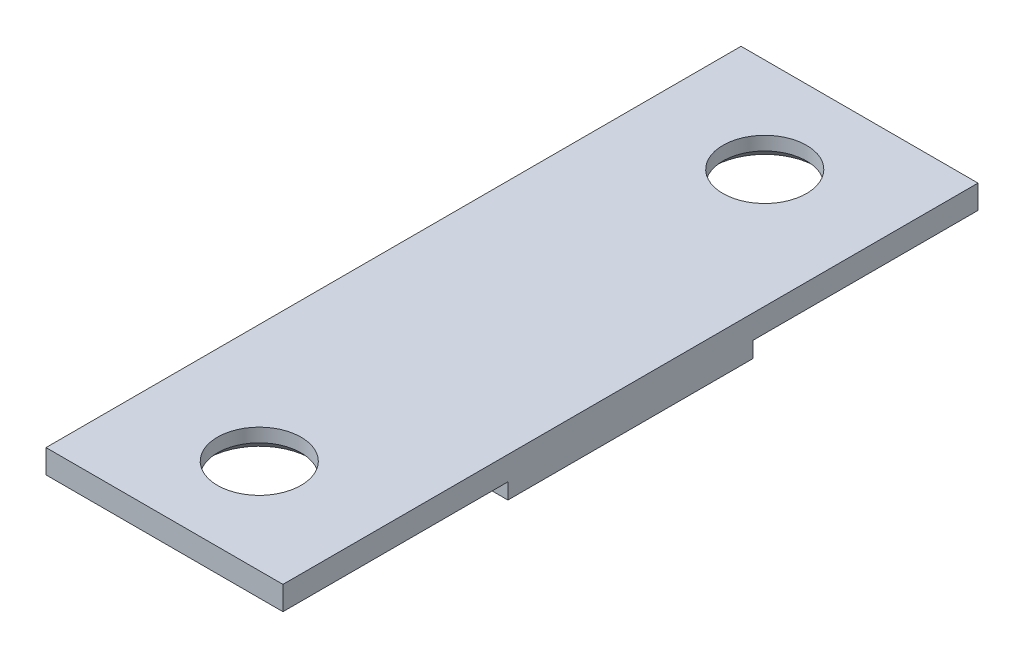
ISO-10303-21;
HEADER;
FILE_DESCRIPTION(('STEP AP214'),'2;1');
FILE_NAME('part.step','',(''),(''),'','','');
FILE_SCHEMA(('AUTOMOTIVE_DESIGN { 1 0 10303 214 1 1 1 1 }'));
ENDSEC;
DATA;
#1=APPLICATION_CONTEXT('core data for automotive mechanical design processes');
#2=APPLICATION_PROTOCOL_DEFINITION('international standard','automotive_design',2000,#1);
#3=PRODUCT_CONTEXT('',#1,'mechanical');
#4=PRODUCT('Part','Part','',(#3));
#5=PRODUCT_RELATED_PRODUCT_CATEGORY('part','',(#4));
#6=PRODUCT_DEFINITION_FORMATION('','',#4);
#7=PRODUCT_DEFINITION_CONTEXT('part definition',#1,'design');
#8=PRODUCT_DEFINITION('design','',#6,#7);
#9=PRODUCT_DEFINITION_SHAPE('','',#8);
#10=(LENGTH_UNIT() NAMED_UNIT(*) SI_UNIT(.MILLI.,.METRE.));
#11=(NAMED_UNIT(*) PLANE_ANGLE_UNIT() SI_UNIT($,.RADIAN.));
#12=(NAMED_UNIT(*) SI_UNIT($,.STERADIAN.) SOLID_ANGLE_UNIT());
#13=UNCERTAINTY_MEASURE_WITH_UNIT(LENGTH_MEASURE(1.E-05),#10,'distance_accuracy_value','');
#14=(GEOMETRIC_REPRESENTATION_CONTEXT(3) GLOBAL_UNCERTAINTY_ASSIGNED_CONTEXT((#13)) GLOBAL_UNIT_ASSIGNED_CONTEXT((#10,
#11,#12)) REPRESENTATION_CONTEXT('',''));
#15=CARTESIAN_POINT('',(0.,0.,0.));
#16=DIRECTION('',(0.,0.,1.));
#17=DIRECTION('',(1.,0.,0.));
#18=AXIS2_PLACEMENT_3D('',#15,#16,#17);
#19=CARTESIAN_POINT('',(-5.953125,1.984375,-17.4625));
#20=DIRECTION('',(1.,0.,0.));
#21=DIRECTION('',(0.,0.,-1.));
#22=AXIS2_PLACEMENT_3D('',#19,#20,#21);
#23=PLANE('',#22);
#24=DIRECTION('',(0.,-1.,0.));
#25=VECTOR('',#24,1.);
#26=CARTESIAN_POINT('',(-5.953125,18.4019637918466,-6.15858772700051));
#27=LINE('',#26,#25);
#28=CARTESIAN_POINT('',(-5.953125,0.793749999999999,-6.15858772700051));
#29=VERTEX_POINT('',#28);
#30=CARTESIAN_POINT('',(-5.953125,0.,-6.15858772700051));
#31=VERTEX_POINT('',#30);
#32=EDGE_CURVE('E202',#29,#31,#27,.T.);
#33=ORIENTED_EDGE('',*,*,#32,.T.);
#34=DIRECTION('',(0.,0.,1.));
#35=VECTOR('',#34,1.);
#36=CARTESIAN_POINT('',(-5.953125,0.,-17.4625));
#37=LINE('',#36,#35);
#38=CARTESIAN_POINT('',(-5.953125,0.,6.15858772700051));
#39=VERTEX_POINT('',#38);
#40=EDGE_CURVE('E56',#31,#39,#37,.T.);
#41=ORIENTED_EDGE('',*,*,#40,.T.);
#42=DIRECTION('',(0.,-1.,0.));
#43=VECTOR('',#42,1.);
#44=CARTESIAN_POINT('',(-5.953125,18.4019637918466,6.15858772700051));
#45=LINE('',#44,#43);
#46=CARTESIAN_POINT('',(-5.953125,0.793749999999999,6.15858772700051));
#47=VERTEX_POINT('',#46);
#48=EDGE_CURVE('E219',#47,#39,#45,.T.);
#49=ORIENTED_EDGE('',*,*,#48,.F.);
#50=DIRECTION('',(0.,0.,-1.));
#51=VECTOR('',#50,1.);
#52=CARTESIAN_POINT('',(-5.953125,0.793749999999999,17.4625));
#53=LINE('',#52,#51);
#54=CARTESIAN_POINT('',(-5.953125,0.793749999999999,17.4625));
#55=VERTEX_POINT('',#54);
#56=EDGE_CURVE('E216',#55,#47,#53,.T.);
#57=ORIENTED_EDGE('',*,*,#56,.F.);
#58=DIRECTION('',(0.,-1.,0.));
#59=VECTOR('',#58,1.);
#60=CARTESIAN_POINT('',(-5.953125,1.984375,17.4625));
#61=LINE('',#60,#59);
#62=CARTESIAN_POINT('',(-5.953125,1.984375,17.4625));
#63=VERTEX_POINT('',#62);
#64=EDGE_CURVE('E127',#63,#55,#61,.T.);
#65=ORIENTED_EDGE('',*,*,#64,.F.);
#66=DIRECTION('',(0.,0.,1.));
#67=VECTOR('',#66,1.);
#68=CARTESIAN_POINT('',(-5.953125,1.984375,-17.4625));
#69=LINE('',#68,#67);
#70=CARTESIAN_POINT('',(-5.953125,1.984375,-17.4625));
#71=VERTEX_POINT('',#70);
#72=EDGE_CURVE('E227',#71,#63,#69,.T.);
#73=ORIENTED_EDGE('',*,*,#72,.F.);
#74=DIRECTION('',(0.,-1.,0.));
#75=VECTOR('',#74,1.);
#76=CARTESIAN_POINT('',(-5.953125,1.984375,-17.4625));
#77=LINE('',#76,#75);
#78=CARTESIAN_POINT('',(-5.953125,0.793749999999999,-17.4625));
#79=VERTEX_POINT('',#78);
#80=EDGE_CURVE('E124',#71,#79,#77,.T.);
#81=ORIENTED_EDGE('',*,*,#80,.T.);
#82=DIRECTION('',(0.,0.,1.));
#83=VECTOR('',#82,1.);
#84=CARTESIAN_POINT('',(-5.953125,0.793749999999999,-17.4625));
#85=LINE('',#84,#83);
#86=EDGE_CURVE('E105',#79,#29,#85,.T.);
#87=ORIENTED_EDGE('',*,*,#86,.T.);
#88=EDGE_LOOP('',(#33,#41,#49,#57,#65,#73,#81,#87));
#89=FACE_BOUND('',#88,.T.);
#90=ADVANCED_FACE('F33',(#89),#23,.F.);
#91=CARTESIAN_POINT('',(5.953125,1.984375,-17.4625));
#92=DIRECTION('',(-1.,0.,0.));
#93=DIRECTION('',(0.,0.,1.));
#94=AXIS2_PLACEMENT_3D('',#91,#92,#93);
#95=PLANE('',#94);
#96=DIRECTION('',(0.,-1.,0.));
#97=VECTOR('',#96,1.);
#98=CARTESIAN_POINT('',(5.953125,18.4019637918466,-6.15858772700051));
#99=LINE('',#98,#97);
#100=CARTESIAN_POINT('',(5.953125,0.793749999999999,-6.15858772700051));
#101=VERTEX_POINT('',#100);
#102=CARTESIAN_POINT('',(5.953125,0.,-6.15858772700051));
#103=VERTEX_POINT('',#102);
#104=EDGE_CURVE('E48',#101,#103,#99,.T.);
#105=ORIENTED_EDGE('',*,*,#104,.F.);
#106=DIRECTION('',(0.,0.,-1.));
#107=VECTOR('',#106,1.);
#108=CARTESIAN_POINT('',(5.953125,0.793749999999999,-17.4625));
#109=LINE('',#108,#107);
#110=CARTESIAN_POINT('',(5.953125,0.793749999999999,-17.4625));
#111=VERTEX_POINT('',#110);
#112=EDGE_CURVE('E103',#101,#111,#109,.T.);
#113=ORIENTED_EDGE('',*,*,#112,.T.);
#114=DIRECTION('',(0.,-1.,0.));
#115=VECTOR('',#114,1.);
#116=CARTESIAN_POINT('',(5.953125,1.984375,-17.4625));
#117=LINE('',#116,#115);
#118=CARTESIAN_POINT('',(5.953125,1.984375,-17.4625));
#119=VERTEX_POINT('',#118);
#120=EDGE_CURVE('E115',#119,#111,#117,.T.);
#121=ORIENTED_EDGE('',*,*,#120,.F.);
#122=DIRECTION('',(0.,0.,-1.));
#123=VECTOR('',#122,1.);
#124=CARTESIAN_POINT('',(5.953125,1.984375,-17.4625));
#125=LINE('',#124,#123);
#126=CARTESIAN_POINT('',(5.953125,1.984375,17.4625));
#127=VERTEX_POINT('',#126);
#128=EDGE_CURVE('E233',#127,#119,#125,.T.);
#129=ORIENTED_EDGE('',*,*,#128,.F.);
#130=DIRECTION('',(0.,-1.,0.));
#131=VECTOR('',#130,1.);
#132=CARTESIAN_POINT('',(5.953125,1.984375,17.4625));
#133=LINE('',#132,#131);
#134=CARTESIAN_POINT('',(5.953125,0.793749999999999,17.4625));
#135=VERTEX_POINT('',#134);
#136=EDGE_CURVE('E123',#127,#135,#133,.T.);
#137=ORIENTED_EDGE('',*,*,#136,.T.);
#138=DIRECTION('',(0.,0.,1.));
#139=VECTOR('',#138,1.);
#140=CARTESIAN_POINT('',(5.953125,0.793749999999999,17.4625));
#141=LINE('',#140,#139);
#142=CARTESIAN_POINT('',(5.953125,0.793749999999999,6.15858772700051));
#143=VERTEX_POINT('',#142);
#144=EDGE_CURVE('E222',#143,#135,#141,.T.);
#145=ORIENTED_EDGE('',*,*,#144,.F.);
#146=DIRECTION('',(0.,-1.,0.));
#147=VECTOR('',#146,1.);
#148=CARTESIAN_POINT('',(5.953125,18.4019637918466,6.15858772700051));
#149=LINE('',#148,#147);
#150=CARTESIAN_POINT('',(5.953125,0.,6.15858772700051));
#151=VERTEX_POINT('',#150);
#152=EDGE_CURVE('E215',#143,#151,#149,.T.);
#153=ORIENTED_EDGE('',*,*,#152,.T.);
#154=DIRECTION('',(0.,0.,-1.));
#155=VECTOR('',#154,1.);
#156=CARTESIAN_POINT('',(5.953125,0.,-17.4625));
#157=LINE('',#156,#155);
#158=EDGE_CURVE('E231',#151,#103,#157,.T.);
#159=ORIENTED_EDGE('',*,*,#158,.T.);
#160=EDGE_LOOP('',(#105,#113,#121,#129,#137,#145,#153,#159));
#161=FACE_BOUND('',#160,.T.);
#162=ADVANCED_FACE('F113',(#161),#95,.F.);
#163=CARTESIAN_POINT('',(-5.953125,0.,17.4625));
#164=DIRECTION('',(0.,1.,0.));
#165=DIRECTION('',(0.,0.,1.));
#166=AXIS2_PLACEMENT_3D('',#163,#164,#165);
#167=PLANE('',#166);
#168=DIRECTION('',(1.,0.,0.));
#169=VECTOR('',#168,1.);
#170=CARTESIAN_POINT('',(-5.953125,0.,-6.15858772700051));
#171=LINE('',#170,#169);
#172=EDGE_CURVE('E205',#31,#103,#171,.T.);
#173=ORIENTED_EDGE('',*,*,#172,.T.);
#174=ORIENTED_EDGE('',*,*,#158,.F.);
#175=DIRECTION('',(1.,0.,0.));
#176=VECTOR('',#175,1.);
#177=CARTESIAN_POINT('',(-5.953125,0.,6.15858772700051));
#178=LINE('',#177,#176);
#179=EDGE_CURVE('E118',#39,#151,#178,.T.);
#180=ORIENTED_EDGE('',*,*,#179,.F.);
#181=ORIENTED_EDGE('',*,*,#40,.F.);
#182=EDGE_LOOP('',(#173,#174,#180,#181));
#183=FACE_BOUND('',#182,.T.);
#184=ADVANCED_FACE('F159',(#183),#167,.F.);
#185=CARTESIAN_POINT('',(-5.953125,1.984375,17.4625));
#186=DIRECTION('',(0.,0.,-1.));
#187=DIRECTION('',(-1.,0.,0.));
#188=AXIS2_PLACEMENT_3D('',#185,#186,#187);
#189=PLANE('',#188);
#190=ORIENTED_EDGE('',*,*,#64,.T.);
#191=DIRECTION('',(-1.,0.,0.));
#192=VECTOR('',#191,1.);
#193=CARTESIAN_POINT('',(-5.953125,0.793749999999999,17.4625));
#194=LINE('',#193,#192);
#195=EDGE_CURVE('E220',#135,#55,#194,.T.);
#196=ORIENTED_EDGE('',*,*,#195,.F.);
#197=ORIENTED_EDGE('',*,*,#136,.F.);
#198=DIRECTION('',(1.,0.,0.));
#199=VECTOR('',#198,1.);
#200=CARTESIAN_POINT('',(-5.953125,1.984375,17.4625));
#201=LINE('',#200,#199);
#202=EDGE_CURVE('E230',#63,#127,#201,.T.);
#203=ORIENTED_EDGE('',*,*,#202,.F.);
#204=EDGE_LOOP('',(#190,#196,#197,#203));
#205=FACE_BOUND('',#204,.T.);
#206=ADVANCED_FACE('F162',(#205),#189,.F.);
#207=CARTESIAN_POINT('',(-5.953125,1.984375,-17.4625));
#208=DIRECTION('',(0.,0.,1.));
#209=DIRECTION('',(1.,0.,0.));
#210=AXIS2_PLACEMENT_3D('',#207,#208,#209);
#211=PLANE('',#210);
#212=ORIENTED_EDGE('',*,*,#120,.T.);
#213=DIRECTION('',(-1.,0.,0.));
#214=VECTOR('',#213,1.);
#215=CARTESIAN_POINT('',(-5.953125,0.793749999999999,-17.4625));
#216=LINE('',#215,#214);
#217=EDGE_CURVE('E100',#111,#79,#216,.T.);
#218=ORIENTED_EDGE('',*,*,#217,.T.);
#219=ORIENTED_EDGE('',*,*,#80,.F.);
#220=DIRECTION('',(-1.,0.,0.));
#221=VECTOR('',#220,1.);
#222=CARTESIAN_POINT('',(-5.953125,1.984375,-17.4625));
#223=LINE('',#222,#221);
#224=EDGE_CURVE('E122',#119,#71,#223,.T.);
#225=ORIENTED_EDGE('',*,*,#224,.F.);
#226=EDGE_LOOP('',(#212,#218,#219,#225));
#227=FACE_BOUND('',#226,.T.);
#228=ADVANCED_FACE('F121',(#227),#211,.F.);
#229=CARTESIAN_POINT('',(-5.953125,1.984375,17.4625));
#230=DIRECTION('',(0.,1.,0.));
#231=DIRECTION('',(0.,0.,1.));
#232=AXIS2_PLACEMENT_3D('',#229,#230,#231);
#233=PLANE('',#232);
#234=CARTESIAN_POINT('',(0.,1.984375,12.7));
#235=DIRECTION('',(0.,1.,0.));
#236=DIRECTION('',(0.,0.,1.));
#237=AXIS2_PLACEMENT_3D('',#234,#235,#236);
#238=CIRCLE('',#237,2.1);
#239=CARTESIAN_POINT('',(0.,1.984375,14.8));
#240=VERTEX_POINT('',#239);
#241=EDGE_CURVE('E198',#240,#240,#238,.T.);
#242=ORIENTED_EDGE('',*,*,#241,.F.);
#243=EDGE_LOOP('',(#242));
#244=FACE_BOUND('',#243,.T.);
#245=CARTESIAN_POINT('',(0.,1.984375,-12.7));
#246=DIRECTION('',(0.,1.,0.));
#247=DIRECTION('',(0.,0.,1.));
#248=AXIS2_PLACEMENT_3D('',#245,#246,#247);
#249=CIRCLE('',#248,2.1);
#250=CARTESIAN_POINT('',(0.,1.984375,-10.6));
#251=VERTEX_POINT('',#250);
#252=EDGE_CURVE('E199',#251,#251,#249,.T.);
#253=ORIENTED_EDGE('',*,*,#252,.F.);
#254=EDGE_LOOP('',(#253));
#255=FACE_BOUND('',#254,.T.);
#256=ORIENTED_EDGE('',*,*,#72,.T.);
#257=ORIENTED_EDGE('',*,*,#202,.T.);
#258=ORIENTED_EDGE('',*,*,#128,.T.);
#259=ORIENTED_EDGE('',*,*,#224,.T.);
#260=EDGE_LOOP('',(#256,#257,#258,#259));
#261=FACE_BOUND('',#260,.T.);
#262=ADVANCED_FACE('F168',(#244,#255,#261),#233,.T.);
#263=CARTESIAN_POINT('',(-5.953125,0.79375,17.4625));
#264=DIRECTION('',(0.,1.,0.));
#265=DIRECTION('',(0.,0.,1.));
#266=AXIS2_PLACEMENT_3D('',#263,#264,#265);
#267=PLANE('',#266);
#268=CARTESIAN_POINT('',(0.,0.79375,12.7));
#269=DIRECTION('',(0.,1.,0.));
#270=DIRECTION('',(0.,0.,1.));
#271=AXIS2_PLACEMENT_3D('',#268,#269,#270);
#272=CIRCLE('',#271,2.60800000000001);
#273=CARTESIAN_POINT('',(0.,0.79375,15.308));
#274=VERTEX_POINT('',#273);
#275=EDGE_CURVE('E41',#274,#274,#272,.T.);
#276=ORIENTED_EDGE('',*,*,#275,.T.);
#277=EDGE_LOOP('',(#276));
#278=FACE_BOUND('',#277,.T.);
#279=ORIENTED_EDGE('',*,*,#56,.T.);
#280=DIRECTION('',(1.,0.,0.));
#281=VECTOR('',#280,1.);
#282=CARTESIAN_POINT('',(-5.953125,0.793749999999999,6.15858772700051));
#283=LINE('',#282,#281);
#284=EDGE_CURVE('E212',#47,#143,#283,.T.);
#285=ORIENTED_EDGE('',*,*,#284,.T.);
#286=ORIENTED_EDGE('',*,*,#144,.T.);
#287=ORIENTED_EDGE('',*,*,#195,.T.);
#288=EDGE_LOOP('',(#279,#285,#286,#287));
#289=FACE_BOUND('',#288,.T.);
#290=ADVANCED_FACE('F142',(#278,#289),#267,.F.);
#291=CARTESIAN_POINT('',(-5.953125,18.4019637918466,6.15858772700051));
#292=DIRECTION('',(0.,0.,-1.));
#293=DIRECTION('',(-1.,0.,0.));
#294=AXIS2_PLACEMENT_3D('',#291,#292,#293);
#295=PLANE('',#294);
#296=ORIENTED_EDGE('',*,*,#48,.T.);
#297=ORIENTED_EDGE('',*,*,#179,.T.);
#298=ORIENTED_EDGE('',*,*,#152,.F.);
#299=ORIENTED_EDGE('',*,*,#284,.F.);
#300=EDGE_LOOP('',(#296,#297,#298,#299));
#301=FACE_BOUND('',#300,.T.);
#302=ADVANCED_FACE('F177',(#301),#295,.F.);
#303=CARTESIAN_POINT('',(-5.953125,18.4019637918466,-6.15858772700051));
#304=DIRECTION('',(0.,0.,-1.));
#305=DIRECTION('',(-1.,0.,0.));
#306=AXIS2_PLACEMENT_3D('',#303,#304,#305);
#307=PLANE('',#306);
#308=DIRECTION('',(1.,0.,0.));
#309=VECTOR('',#308,1.);
#310=CARTESIAN_POINT('',(-5.953125,0.793749999999999,-6.15858772700051));
#311=LINE('',#310,#309);
#312=EDGE_CURVE('E119',#29,#101,#311,.T.);
#313=ORIENTED_EDGE('',*,*,#312,.T.);
#314=ORIENTED_EDGE('',*,*,#104,.T.);
#315=ORIENTED_EDGE('',*,*,#172,.F.);
#316=ORIENTED_EDGE('',*,*,#32,.F.);
#317=EDGE_LOOP('',(#313,#314,#315,#316));
#318=FACE_BOUND('',#317,.T.);
#319=ADVANCED_FACE('F180',(#318),#307,.T.);
#320=CARTESIAN_POINT('',(-5.953125,0.79375,17.4625));
#321=DIRECTION('',(0.,1.,0.));
#322=DIRECTION('',(0.,0.,1.));
#323=AXIS2_PLACEMENT_3D('',#320,#321,#322);
#324=PLANE('',#323);
#325=CARTESIAN_POINT('',(0.,0.79375,-12.7));
#326=DIRECTION('',(0.,1.,0.));
#327=DIRECTION('',(0.,0.,1.));
#328=AXIS2_PLACEMENT_3D('',#325,#326,#327);
#329=CIRCLE('',#328,2.60800000000001);
#330=CARTESIAN_POINT('',(0.,0.79375,-10.092));
#331=VERTEX_POINT('',#330);
#332=EDGE_CURVE('E134',#331,#331,#329,.T.);
#333=ORIENTED_EDGE('',*,*,#332,.T.);
#334=EDGE_LOOP('',(#333));
#335=FACE_BOUND('',#334,.T.);
#336=ORIENTED_EDGE('',*,*,#217,.F.);
#337=ORIENTED_EDGE('',*,*,#112,.F.);
#338=ORIENTED_EDGE('',*,*,#312,.F.);
#339=ORIENTED_EDGE('',*,*,#86,.F.);
#340=EDGE_LOOP('',(#336,#337,#338,#339));
#341=FACE_BOUND('',#340,.T.);
#342=ADVANCED_FACE('F102',(#335,#341),#324,.F.);
#343=CARTESIAN_POINT('',(0.,0.,-12.7));
#344=DIRECTION('',(0.,1.,0.));
#345=DIRECTION('',(0.,0.,1.));
#346=AXIS2_PLACEMENT_3D('',#343,#344,#345);
#347=CYLINDRICAL_SURFACE('',#346,2.1);
#348=CARTESIAN_POINT('',(0.,1.30175000000001,-12.7));
#349=DIRECTION('',(0.,1.,0.));
#350=DIRECTION('',(0.,0.,1.));
#351=AXIS2_PLACEMENT_3D('',#348,#349,#350);
#352=CIRCLE('',#351,2.1);
#353=CARTESIAN_POINT('',(0.,1.30175000000001,-10.6));
#354=VERTEX_POINT('',#353);
#355=EDGE_CURVE('E137',#354,#354,#352,.F.);
#356=ORIENTED_EDGE('',*,*,#355,.T.);
#357=EDGE_LOOP('',(#356));
#358=FACE_BOUND('',#357,.T.);
#359=ORIENTED_EDGE('',*,*,#252,.T.);
#360=EDGE_LOOP('',(#359));
#361=FACE_BOUND('',#360,.T.);
#362=ADVANCED_FACE('F184',(#358,#361),#347,.F.);
#363=CARTESIAN_POINT('',(0.,0.,12.7));
#364=DIRECTION('',(0.,1.,0.));
#365=DIRECTION('',(0.,0.,1.));
#366=AXIS2_PLACEMENT_3D('',#363,#364,#365);
#367=CYLINDRICAL_SURFACE('',#366,2.1);
#368=CARTESIAN_POINT('',(0.,1.30175000000001,12.7));
#369=DIRECTION('',(0.,1.,0.));
#370=DIRECTION('',(0.,0.,1.));
#371=AXIS2_PLACEMENT_3D('',#368,#369,#370);
#372=CIRCLE('',#371,2.1);
#373=CARTESIAN_POINT('',(0.,1.30175000000001,14.8));
#374=VERTEX_POINT('',#373);
#375=EDGE_CURVE('E12',#374,#374,#372,.F.);
#376=ORIENTED_EDGE('',*,*,#375,.T.);
#377=EDGE_LOOP('',(#376));
#378=FACE_BOUND('',#377,.T.);
#379=ORIENTED_EDGE('',*,*,#241,.T.);
#380=EDGE_LOOP('',(#379));
#381=FACE_BOUND('',#380,.T.);
#382=ADVANCED_FACE('F151',(#378,#381),#367,.F.);
#383=CARTESIAN_POINT('',(0.,0.79375,-12.7));
#384=DIRECTION('',(0.,-1.,0.));
#385=DIRECTION('',(0.,0.,-1.));
#386=AXIS2_PLACEMENT_3D('',#383,#384,#385);
#387=CONICAL_SURFACE('',#386,2.60800000000001,0.785398163397445);
#388=ORIENTED_EDGE('',*,*,#355,.F.);
#389=EDGE_LOOP('',(#388));
#390=FACE_BOUND('',#389,.T.);
#391=ORIENTED_EDGE('',*,*,#332,.F.);
#392=EDGE_LOOP('',(#391));
#393=FACE_BOUND('',#392,.T.);
#394=ADVANCED_FACE('F146',(#390,#393),#387,.F.);
#395=CARTESIAN_POINT('',(0.,0.79375,12.7));
#396=DIRECTION('',(0.,-1.,0.));
#397=DIRECTION('',(0.,0.,-1.));
#398=AXIS2_PLACEMENT_3D('',#395,#396,#397);
#399=CONICAL_SURFACE('',#398,2.60800000000001,0.785398163397445);
#400=ORIENTED_EDGE('',*,*,#375,.F.);
#401=EDGE_LOOP('',(#400));
#402=FACE_BOUND('',#401,.T.);
#403=ORIENTED_EDGE('',*,*,#275,.F.);
#404=EDGE_LOOP('',(#403));
#405=FACE_BOUND('',#404,.T.);
#406=ADVANCED_FACE('F35',(#402,#405),#399,.F.);
#407=CLOSED_SHELL('',(#90,#162,#184,#206,#228,#262,#290,#302,#319,#342,#362,#382,#394,#406));
#408=MANIFOLD_SOLID_BREP('B2',#407);
#409=ADVANCED_BREP_SHAPE_REPRESENTATION('',(#18,#408),#14);
#410=SHAPE_DEFINITION_REPRESENTATION(#9,#409);
ENDSEC;
END-ISO-10303-21;
